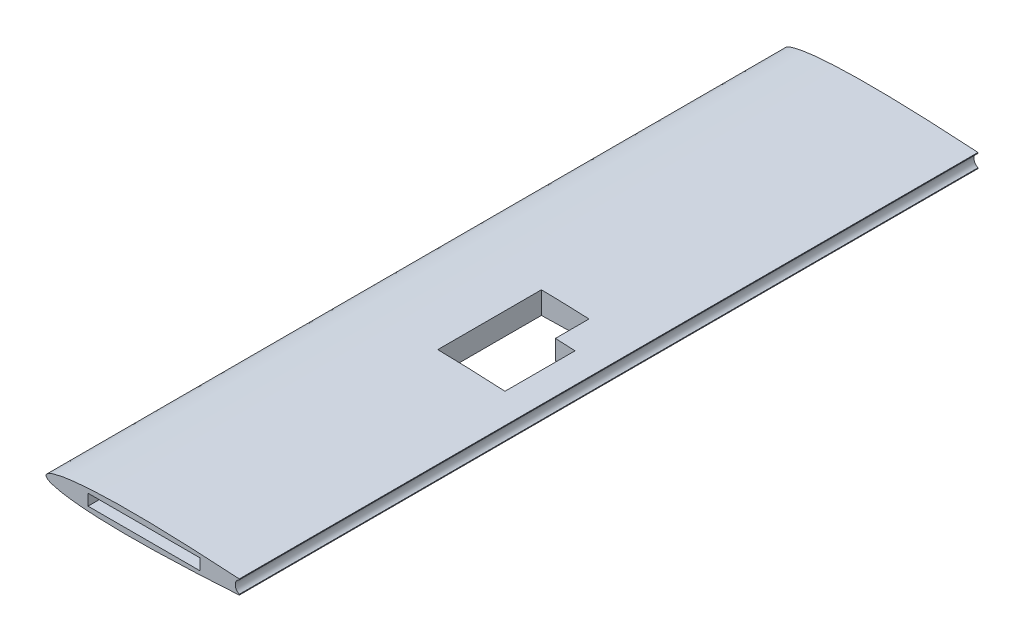
ISO-10303-21;
HEADER;
FILE_DESCRIPTION(('STEP AP214'),'2;1');
FILE_NAME('part.step','',(''),(''),'','','');
FILE_SCHEMA(('AUTOMOTIVE_DESIGN { 1 0 10303 214 1 1 1 1 }'));
ENDSEC;
DATA;
#1=APPLICATION_CONTEXT('core data for automotive mechanical design processes');
#2=APPLICATION_PROTOCOL_DEFINITION('international standard','automotive_design',2000,#1);
#3=PRODUCT_CONTEXT('',#1,'mechanical');
#4=PRODUCT('Part','Part','',(#3));
#5=PRODUCT_RELATED_PRODUCT_CATEGORY('part','',(#4));
#6=PRODUCT_DEFINITION_FORMATION('','',#4);
#7=PRODUCT_DEFINITION_CONTEXT('part definition',#1,'design');
#8=PRODUCT_DEFINITION('design','',#6,#7);
#9=PRODUCT_DEFINITION_SHAPE('','',#8);
#10=(LENGTH_UNIT() NAMED_UNIT(*) SI_UNIT(.MILLI.,.METRE.));
#11=(NAMED_UNIT(*) PLANE_ANGLE_UNIT() SI_UNIT($,.RADIAN.));
#12=(NAMED_UNIT(*) SI_UNIT($,.STERADIAN.) SOLID_ANGLE_UNIT());
#13=UNCERTAINTY_MEASURE_WITH_UNIT(LENGTH_MEASURE(1.E-05),#10,'distance_accuracy_value','');
#14=(GEOMETRIC_REPRESENTATION_CONTEXT(3) GLOBAL_UNCERTAINTY_ASSIGNED_CONTEXT((#13)) GLOBAL_UNIT_ASSIGNED_CONTEXT((#10,
#11,#12)) REPRESENTATION_CONTEXT('',''));
#15=CARTESIAN_POINT('',(0.,0.,0.));
#16=DIRECTION('',(0.,0.,1.));
#17=DIRECTION('',(1.,0.,0.));
#18=AXIS2_PLACEMENT_3D('',#15,#16,#17);
#19=CARTESIAN_POINT('',(0.,0.,0.));
#20=DIRECTION('',(0.,0.,-1.));
#21=DIRECTION('',(-1.,0.,0.));
#22=AXIS2_PLACEMENT_3D('',#19,#20,#21);
#23=PLANE('',#22);
#24=DIRECTION('',(0.,1.,0.));
#25=VECTOR('',#24,1.);
#26=CARTESIAN_POINT('',(69.0000000000131,0.,0.));
#27=LINE('',#26,#25);
#28=CARTESIAN_POINT('',(69.0000000000148,-2.50744788017682,0.));
#29=VERTEX_POINT('',#28);
#30=CARTESIAN_POINT('',(69.0000000000131,-2.22895693094243,0.));
#31=VERTEX_POINT('',#30);
#32=EDGE_CURVE('E321',#29,#31,#27,.T.);
#33=ORIENTED_EDGE('',*,*,#32,.F.);
#34=CARTESIAN_POINT('',(100.,0.084,0.));
#35=CARTESIAN_POINT('',(98.333488814933,0.236746480055364,0.));
#36=CARTESIAN_POINT('',(95.0011947254255,0.542172688557606,0.));
#37=CARTESIAN_POINT('',(88.3355596211879,1.11089898015662,0.));
#38=CARTESIAN_POINT('',(80.0032933562199,1.76361099520967,0.));
#39=CARTESIAN_POINT('',(70.0029989334555,2.45786169254404,0.));
#40=CARTESIAN_POINT('',(60.0031046254057,3.06174772348002,0.));
#41=CARTESIAN_POINT('',(50.0030086005351,3.55213921170033,0.));
#42=CARTESIAN_POINT('',(40.0025985576922,3.90294649372571,0.));
#43=CARTESIAN_POINT('',(31.666961485844,4.02526015065941,0.));
#44=CARTESIAN_POINT('',(24.9991546003269,3.97693379087482,0.));
#45=CARTESIAN_POINT('',(19.9977755867835,3.84497639830756,0.));
#46=CARTESIAN_POINT('',(14.9933631314586,3.59248695861782,0.));
#47=CARTESIAN_POINT('',(10.8271840648808,3.23765157891607,0.));
#48=CARTESIAN_POINT('',(7.48905438800269,2.81402136675529,0.));
#49=CARTESIAN_POINT('',(4.99359465012965,2.40367305928858,0.));
#50=CARTESIAN_POINT('',(2.84962633983361,1.86792549429032,0.));
#51=CARTESIAN_POINT('',(1.16541350274339,1.32098725183071,0.));
#52=CARTESIAN_POINT('',(-0.664613784127027,0.,0.));
#53=CARTESIAN_POINT('',(1.16541350274339,-1.32098725183071,0.));
#54=CARTESIAN_POINT('',(2.84962633983362,-1.86792549429032,0.));
#55=CARTESIAN_POINT('',(4.99359465012963,-2.40367305928857,0.));
#56=CARTESIAN_POINT('',(7.48905438800269,-2.81402136675529,0.));
#57=CARTESIAN_POINT('',(10.8271840648809,-3.23765157891607,0.));
#58=CARTESIAN_POINT('',(14.9933631314586,-3.59248695861782,0.));
#59=CARTESIAN_POINT('',(19.9977755867835,-3.84497639830756,0.));
#60=CARTESIAN_POINT('',(24.9991546003269,-3.97693379087482,0.));
#61=CARTESIAN_POINT('',(31.666961485844,-4.02526015065941,0.));
#62=CARTESIAN_POINT('',(40.0025985576922,-3.90294649372571,0.));
#63=CARTESIAN_POINT('',(50.0030086005351,-3.55213921170033,0.));
#64=CARTESIAN_POINT('',(60.0031046254058,-3.06174772348002,0.));
#65=CARTESIAN_POINT('',(70.0029989334555,-2.45786169254404,0.));
#66=CARTESIAN_POINT('',(80.0032933562199,-1.76361099520967,0.));
#67=CARTESIAN_POINT('',(88.3355596211879,-1.11089898015662,0.));
#68=CARTESIAN_POINT('',(95.0011947254255,-0.542172688557605,0.));
#69=CARTESIAN_POINT('',(98.333488814933,-0.236746480055364,0.));
#70=CARTESIAN_POINT('',(100.,-0.084,0.));
#71=B_SPLINE_CURVE_WITH_KNOTS('',3,(#34,#35,#36,#37,#38,#39,#40,#41,#42,#43,#44,#45,#46,#47,#48,
#49,#50,#51,#52,#53,#54,#55,#56,#57,#58,#59,#60,#61,#62,#63,#64,#65,#66,#67,#68,#69,#70),
.UNSPECIFIED.,.F.,.F.,(4,1,1,1,1,1,1,1,1,1,1,1,1,1,1,1,1,1,1,1,1,1,1,1,1,1,1,1,1,1,1,1,1,1,4),
(0.,0.0248762929189861,0.0497417146704998,0.0994434021110951,0.149112224036195,
0.198750974066913,0.248359097492202,0.297937369716024,0.347491327096237,0.37226694027957,
0.39705092368842,0.421859474838904,0.446731345826762,0.459220451479859,0.471790601601357,
0.484560454432956,0.491195112481227,0.5,0.508804887518773,0.515439545567044,0.528209398398643,
0.540779548520141,0.553268654173238,0.578140525161096,0.60294907631158,0.62773305972043,
0.652508672903763,0.702062630283976,0.751640902507798,0.801249025933086,0.850887775963805,
0.900556597888905,0.9502582853295,0.975123707081014,1.),.UNSPECIFIED.);
#72=CARTESIAN_POINT('',(69.0000000000131,2.50744788017694,0.));
#73=VERTEX_POINT('',#72);
#74=EDGE_CURVE('E305',#73,#29,#71,.T.);
#75=ORIENTED_EDGE('',*,*,#74,.F.);
#76=DIRECTION('',(0.,-1.,0.));
#77=VECTOR('',#76,1.);
#78=CARTESIAN_POINT('',(69.0000000000131,2.50744788017694,0.));
#79=LINE('',#78,#77);
#80=CARTESIAN_POINT('',(69.0000000000131,2.22895693094441,0.));
#81=VERTEX_POINT('',#80);
#82=EDGE_CURVE('E284',#73,#81,#79,.T.);
#83=ORIENTED_EDGE('',*,*,#82,.T.);
#84=CARTESIAN_POINT('',(70.0000000000131,9.91394466520745E-13,0.));
#85=DIRECTION('',(0.,0.,-1.));
#86=DIRECTION('',(1.,0.,0.));
#87=AXIS2_PLACEMENT_3D('',#84,#85,#86);
#88=CIRCLE('',#87,2.44300000000014);
#89=EDGE_CURVE('E314',#31,#81,#88,.T.);
#90=ORIENTED_EDGE('',*,*,#89,.F.);
#91=EDGE_LOOP('',(#33,#75,#83,#90));
#92=FACE_BOUND('',#91,.T.);
#93=DIRECTION('',(-1.,0.,0.));
#94=VECTOR('',#93,1.);
#95=CARTESIAN_POINT('',(55.,2.,0.));
#96=LINE('',#95,#94);
#97=CARTESIAN_POINT('',(55.,2.,0.));
#98=VERTEX_POINT('',#97);
#99=CARTESIAN_POINT('',(15.,2.,0.));
#100=VERTEX_POINT('',#99);
#101=EDGE_CURVE('E204',#98,#100,#96,.T.);
#102=ORIENTED_EDGE('',*,*,#101,.T.);
#103=DIRECTION('',(0.,-1.,0.));
#104=VECTOR('',#103,1.);
#105=CARTESIAN_POINT('',(15.,2.,0.));
#106=LINE('',#105,#104);
#107=CARTESIAN_POINT('',(15.,-2.,0.));
#108=VERTEX_POINT('',#107);
#109=EDGE_CURVE('E58',#100,#108,#106,.T.);
#110=ORIENTED_EDGE('',*,*,#109,.T.);
#111=DIRECTION('',(1.,0.,0.));
#112=VECTOR('',#111,1.);
#113=CARTESIAN_POINT('',(55.,-2.,0.));
#114=LINE('',#113,#112);
#115=CARTESIAN_POINT('',(55.,-2.,0.));
#116=VERTEX_POINT('',#115);
#117=EDGE_CURVE('E191',#108,#116,#114,.T.);
#118=ORIENTED_EDGE('',*,*,#117,.T.);
#119=DIRECTION('',(0.,1.,0.));
#120=VECTOR('',#119,1.);
#121=CARTESIAN_POINT('',(55.,2.,0.));
#122=LINE('',#121,#120);
#123=EDGE_CURVE('E195',#116,#98,#122,.T.);
#124=ORIENTED_EDGE('',*,*,#123,.T.);
#125=EDGE_LOOP('',(#102,#110,#118,#124));
#126=FACE_BOUND('',#125,.T.);
#127=ADVANCED_FACE('F41',(#92,#126),#23,.T.);
#128=CARTESIAN_POINT('',(100.,0.084,263.67));
#129=CARTESIAN_POINT('',(98.333488814933,0.236746480055364,263.67));
#130=CARTESIAN_POINT('',(95.0011947254255,0.542172688557606,263.67));
#131=CARTESIAN_POINT('',(88.3355596211879,1.11089898015662,263.67));
#132=CARTESIAN_POINT('',(80.0032933562199,1.76361099520967,263.67));
#133=CARTESIAN_POINT('',(70.0029989334555,2.45786169254404,263.67));
#134=CARTESIAN_POINT('',(60.0031046254057,3.06174772348002,263.67));
#135=CARTESIAN_POINT('',(50.0030086005351,3.55213921170033,263.67));
#136=CARTESIAN_POINT('',(40.0025985576922,3.90294649372571,263.67));
#137=CARTESIAN_POINT('',(31.666961485844,4.02526015065941,263.67));
#138=CARTESIAN_POINT('',(24.9991546003269,3.97693379087482,263.67));
#139=CARTESIAN_POINT('',(19.9977755867835,3.84497639830756,263.67));
#140=CARTESIAN_POINT('',(14.9933631314586,3.59248695861782,263.67));
#141=CARTESIAN_POINT('',(10.8271840648808,3.23765157891607,263.67));
#142=CARTESIAN_POINT('',(7.48905438800269,2.81402136675529,263.67));
#143=CARTESIAN_POINT('',(4.99359465012965,2.40367305928858,263.67));
#144=CARTESIAN_POINT('',(2.84962633983361,1.86792549429032,263.67));
#145=CARTESIAN_POINT('',(1.16541350274339,1.32098725183071,263.67));
#146=CARTESIAN_POINT('',(-0.664613784127027,0.,263.67));
#147=CARTESIAN_POINT('',(1.16541350274339,-1.32098725183071,263.67));
#148=CARTESIAN_POINT('',(2.84962633983362,-1.86792549429032,263.67));
#149=CARTESIAN_POINT('',(4.99359465012963,-2.40367305928857,263.67));
#150=CARTESIAN_POINT('',(7.48905438800269,-2.81402136675529,263.67));
#151=CARTESIAN_POINT('',(10.8271840648809,-3.23765157891607,263.67));
#152=CARTESIAN_POINT('',(14.9933631314586,-3.59248695861782,263.67));
#153=CARTESIAN_POINT('',(19.9977755867835,-3.84497639830756,263.67));
#154=CARTESIAN_POINT('',(24.9991546003269,-3.97693379087482,263.67));
#155=CARTESIAN_POINT('',(31.666961485844,-4.02526015065941,263.67));
#156=CARTESIAN_POINT('',(40.0025985576922,-3.90294649372571,263.67));
#157=CARTESIAN_POINT('',(50.0030086005351,-3.55213921170033,263.67));
#158=CARTESIAN_POINT('',(60.0031046254058,-3.06174772348002,263.67));
#159=CARTESIAN_POINT('',(70.0029989334555,-2.45786169254404,263.67));
#160=CARTESIAN_POINT('',(80.0032933562199,-1.76361099520967,263.67));
#161=CARTESIAN_POINT('',(88.3355596211879,-1.11089898015662,263.67));
#162=CARTESIAN_POINT('',(95.0011947254255,-0.542172688557605,263.67));
#163=CARTESIAN_POINT('',(98.333488814933,-0.236746480055364,263.67));
#164=CARTESIAN_POINT('',(100.,-0.084,263.67));
#165=B_SPLINE_CURVE_WITH_KNOTS('',3,(#128,#129,#130,#131,#132,#133,#134,#135,#136,#137,#138,
#139,#140,#141,#142,#143,#144,#145,#146,#147,#148,#149,#150,#151,#152,#153,#154,#155,#156,#157,
#158,#159,#160,#161,#162,#163,#164),.UNSPECIFIED.,.F.,.F.,(4,1,1,1,1,1,1,1,1,1,1,1,1,1,1,1,1,1,
1,1,1,1,1,1,1,1,1,1,1,1,1,1,1,1,4),(0.,0.0248762929189861,0.0497417146704998,0.0994434021110951,
0.149112224036195,0.198750974066913,0.248359097492202,0.297937369716024,0.347491327096237,
0.37226694027957,0.39705092368842,0.421859474838904,0.446731345826762,0.459220451479859,
0.471790601601357,0.484560454432956,0.491195112481227,0.5,0.508804887518773,0.515439545567044,
0.528209398398643,0.540779548520141,0.553268654173238,0.578140525161096,0.60294907631158,
0.62773305972043,0.652508672903763,0.702062630283976,0.751640902507798,0.801249025933086,
0.850887775963805,0.900556597888905,0.9502582853295,0.975123707081014,1.),.UNSPECIFIED.);
#166=DIRECTION('',(0.,0.,-1.));
#167=VECTOR('',#166,1.);
#168=SURFACE_OF_LINEAR_EXTRUSION('',#165,#167);
#169=CARTESIAN_POINT('',(100.,0.084,158.835));
#170=CARTESIAN_POINT('',(98.333488814933,0.236746480055364,158.835));
#171=CARTESIAN_POINT('',(95.0011947254255,0.542172688557606,158.835));
#172=CARTESIAN_POINT('',(88.3355596211879,1.11089898015662,158.835));
#173=CARTESIAN_POINT('',(80.0032933562199,1.76361099520967,158.835));
#174=CARTESIAN_POINT('',(70.0029989334555,2.45786169254404,158.835));
#175=CARTESIAN_POINT('',(60.0031046254057,3.06174772348002,158.835));
#176=CARTESIAN_POINT('',(50.0030086005351,3.55213921170033,158.835));
#177=CARTESIAN_POINT('',(40.0025985576922,3.90294649372571,158.835));
#178=CARTESIAN_POINT('',(31.666961485844,4.02526015065941,158.835));
#179=CARTESIAN_POINT('',(24.9991546003269,3.97693379087482,158.835));
#180=CARTESIAN_POINT('',(19.9977755867835,3.84497639830756,158.835));
#181=CARTESIAN_POINT('',(14.9933631314586,3.59248695861782,158.835));
#182=CARTESIAN_POINT('',(10.8271840648808,3.23765157891607,158.835));
#183=CARTESIAN_POINT('',(7.48905438800269,2.81402136675529,158.835));
#184=CARTESIAN_POINT('',(4.99359465012965,2.40367305928858,158.835));
#185=CARTESIAN_POINT('',(2.84962633983361,1.86792549429032,158.835));
#186=CARTESIAN_POINT('',(1.16541350274339,1.32098725183071,158.835));
#187=CARTESIAN_POINT('',(-0.664613784127027,0.,158.835));
#188=CARTESIAN_POINT('',(1.16541350274339,-1.32098725183071,158.835));
#189=CARTESIAN_POINT('',(2.84962633983362,-1.86792549429032,158.835));
#190=CARTESIAN_POINT('',(4.99359465012963,-2.40367305928857,158.835));
#191=CARTESIAN_POINT('',(7.48905438800269,-2.81402136675529,158.835));
#192=CARTESIAN_POINT('',(10.8271840648809,-3.23765157891607,158.835));
#193=CARTESIAN_POINT('',(14.9933631314586,-3.59248695861782,158.835));
#194=CARTESIAN_POINT('',(19.9977755867835,-3.84497639830756,158.835));
#195=CARTESIAN_POINT('',(24.9991546003269,-3.97693379087482,158.835));
#196=CARTESIAN_POINT('',(31.666961485844,-4.02526015065941,158.835));
#197=CARTESIAN_POINT('',(40.0025985576922,-3.90294649372571,158.835));
#198=CARTESIAN_POINT('',(50.0030086005351,-3.55213921170033,158.835));
#199=CARTESIAN_POINT('',(60.0031046254058,-3.06174772348002,158.835));
#200=CARTESIAN_POINT('',(70.0029989334555,-2.45786169254404,158.835));
#201=CARTESIAN_POINT('',(80.0032933562199,-1.76361099520967,158.835));
#202=CARTESIAN_POINT('',(88.3355596211879,-1.11089898015662,158.835));
#203=CARTESIAN_POINT('',(95.0011947254255,-0.542172688557605,158.835));
#204=CARTESIAN_POINT('',(98.333488814933,-0.236746480055364,158.835));
#205=CARTESIAN_POINT('',(100.,-0.084,158.835));
#206=B_SPLINE_CURVE_WITH_KNOTS('',3,(#169,#170,#171,#172,#173,#174,#175,#176,#177,#178,#179,
#180,#181,#182,#183,#184,#185,#186,#187,#188,#189,#190,#191,#192,#193,#194,#195,#196,#197,#198,
#199,#200,#201,#202,#203,#204,#205),.UNSPECIFIED.,.F.,.F.,(4,1,1,1,1,1,1,1,1,1,1,1,1,1,1,1,1,1,
1,1,1,1,1,1,1,1,1,1,1,1,1,1,1,1,4),(0.,0.0248762929189861,0.0497417146704998,0.0994434021110951,
0.149112224036195,0.198750974066913,0.248359097492202,0.297937369716024,0.347491327096237,
0.37226694027957,0.39705092368842,0.421859474838904,0.446731345826762,0.459220451479859,
0.471790601601357,0.484560454432956,0.491195112481227,0.5,0.508804887518773,0.515439545567044,
0.528209398398643,0.540779548520141,0.553268654173238,0.578140525161096,0.60294907631158,
0.62773305972043,0.652508672903763,0.702062630283976,0.751640902507798,0.801249025933086,
0.850887775963805,0.900556597888905,0.9502582853295,0.975123707081014,1.),.UNSPECIFIED.);
#207=CARTESIAN_POINT('',(59.0000000000131,3.0971385419133,158.835));
#208=VERTEX_POINT('',#207);
#209=CARTESIAN_POINT('',(35.0000000000106,3.96601398134451,158.835));
#210=VERTEX_POINT('',#209);
#211=EDGE_CURVE('E342',#208,#210,#206,.T.);
#212=ORIENTED_EDGE('',*,*,#211,.T.);
#213=DIRECTION('',(0.,0.,-1.));
#214=VECTOR('',#213,1.);
#215=CARTESIAN_POINT('',(35.0000000000131,3.96601398134447,263.67));
#216=LINE('',#215,#214);
#217=CARTESIAN_POINT('',(35.0000000000131,3.96601398134451,121.835));
#218=VERTEX_POINT('',#217);
#219=EDGE_CURVE('E11',#210,#218,#216,.T.);
#220=ORIENTED_EDGE('',*,*,#219,.T.);
#221=CARTESIAN_POINT('',(100.,0.084,121.835));
#222=CARTESIAN_POINT('',(98.333488814933,0.236746480055364,121.835));
#223=CARTESIAN_POINT('',(95.0011947254255,0.542172688557606,121.835));
#224=CARTESIAN_POINT('',(88.3355596211879,1.11089898015662,121.835));
#225=CARTESIAN_POINT('',(80.0032933562199,1.76361099520967,121.835));
#226=CARTESIAN_POINT('',(70.0029989334555,2.45786169254404,121.835));
#227=CARTESIAN_POINT('',(60.0031046254057,3.06174772348002,121.835));
#228=CARTESIAN_POINT('',(50.0030086005351,3.55213921170033,121.835));
#229=CARTESIAN_POINT('',(40.0025985576922,3.90294649372571,121.835));
#230=CARTESIAN_POINT('',(31.666961485844,4.02526015065941,121.835));
#231=CARTESIAN_POINT('',(24.9991546003269,3.97693379087482,121.835));
#232=CARTESIAN_POINT('',(19.9977755867835,3.84497639830756,121.835));
#233=CARTESIAN_POINT('',(14.9933631314586,3.59248695861782,121.835));
#234=CARTESIAN_POINT('',(10.8271840648808,3.23765157891607,121.835));
#235=CARTESIAN_POINT('',(7.48905438800269,2.81402136675529,121.835));
#236=CARTESIAN_POINT('',(4.99359465012965,2.40367305928858,121.835));
#237=CARTESIAN_POINT('',(2.84962633983361,1.86792549429032,121.835));
#238=CARTESIAN_POINT('',(1.16541350274339,1.32098725183071,121.835));
#239=CARTESIAN_POINT('',(-0.664613784127027,0.,121.835));
#240=CARTESIAN_POINT('',(1.16541350274339,-1.32098725183071,121.835));
#241=CARTESIAN_POINT('',(2.84962633983362,-1.86792549429032,121.835));
#242=CARTESIAN_POINT('',(4.99359465012963,-2.40367305928857,121.835));
#243=CARTESIAN_POINT('',(7.48905438800269,-2.81402136675529,121.835));
#244=CARTESIAN_POINT('',(10.8271840648809,-3.23765157891607,121.835));
#245=CARTESIAN_POINT('',(14.9933631314586,-3.59248695861782,121.835));
#246=CARTESIAN_POINT('',(19.9977755867835,-3.84497639830756,121.835));
#247=CARTESIAN_POINT('',(24.9991546003269,-3.97693379087482,121.835));
#248=CARTESIAN_POINT('',(31.666961485844,-4.02526015065941,121.835));
#249=CARTESIAN_POINT('',(40.0025985576922,-3.90294649372571,121.835));
#250=CARTESIAN_POINT('',(50.0030086005351,-3.55213921170033,121.835));
#251=CARTESIAN_POINT('',(60.0031046254058,-3.06174772348002,121.835));
#252=CARTESIAN_POINT('',(70.0029989334555,-2.45786169254404,121.835));
#253=CARTESIAN_POINT('',(80.0032933562199,-1.76361099520967,121.835));
#254=CARTESIAN_POINT('',(88.3355596211879,-1.11089898015662,121.835));
#255=CARTESIAN_POINT('',(95.0011947254255,-0.542172688557605,121.835));
#256=CARTESIAN_POINT('',(98.333488814933,-0.236746480055364,121.835));
#257=CARTESIAN_POINT('',(100.,-0.084,121.835));
#258=B_SPLINE_CURVE_WITH_KNOTS('',3,(#221,#222,#223,#224,#225,#226,#227,#228,#229,#230,#231,
#232,#233,#234,#235,#236,#237,#238,#239,#240,#241,#242,#243,#244,#245,#246,#247,#248,#249,#250,
#251,#252,#253,#254,#255,#256,#257),.UNSPECIFIED.,.F.,.F.,(4,1,1,1,1,1,1,1,1,1,1,1,1,1,1,1,1,1,
1,1,1,1,1,1,1,1,1,1,1,1,1,1,1,1,4),(0.,0.0248762929189861,0.0497417146704998,0.0994434021110951,
0.149112224036195,0.198750974066913,0.248359097492202,0.297937369716024,0.347491327096237,
0.37226694027957,0.39705092368842,0.421859474838904,0.446731345826762,0.459220451479859,
0.471790601601357,0.484560454432956,0.491195112481227,0.5,0.508804887518773,0.515439545567044,
0.528209398398643,0.540779548520141,0.553268654173238,0.578140525161096,0.60294907631158,
0.62773305972043,0.652508672903763,0.702062630283976,0.751640902507798,0.801249025933086,
0.850887775963805,0.900556597888905,0.9502582853295,0.975123707081014,1.),.UNSPECIFIED.);
#259=CARTESIAN_POINT('',(52.0000000000131,3.4421332996332,121.835));
#260=VERTEX_POINT('',#259);
#261=EDGE_CURVE('E51',#218,#260,#258,.F.);
#262=ORIENTED_EDGE('',*,*,#261,.T.);
#263=DIRECTION('',(0.,0.,-1.));
#264=VECTOR('',#263,1.);
#265=CARTESIAN_POINT('',(52.0000000000131,3.4421332996332,263.67));
#266=LINE('',#265,#264);
#267=CARTESIAN_POINT('',(52.0000000000131,3.44213329876261,133.835));
#268=VERTEX_POINT('',#267);
#269=EDGE_CURVE('E379',#260,#268,#266,.F.);
#270=ORIENTED_EDGE('',*,*,#269,.T.);
#271=CARTESIAN_POINT('',(100.,0.084,133.835));
#272=CARTESIAN_POINT('',(98.333488814933,0.236746480055364,133.835));
#273=CARTESIAN_POINT('',(95.0011947254255,0.542172688557606,133.835));
#274=CARTESIAN_POINT('',(88.3355596211879,1.11089898015662,133.835));
#275=CARTESIAN_POINT('',(80.0032933562199,1.76361099520967,133.835));
#276=CARTESIAN_POINT('',(70.0029989334555,2.45786169254404,133.835));
#277=CARTESIAN_POINT('',(60.0031046254057,3.06174772348002,133.835));
#278=CARTESIAN_POINT('',(50.0030086005351,3.55213921170033,133.835));
#279=CARTESIAN_POINT('',(40.0025985576922,3.90294649372571,133.835));
#280=CARTESIAN_POINT('',(31.666961485844,4.02526015065941,133.835));
#281=CARTESIAN_POINT('',(24.9991546003269,3.97693379087482,133.835));
#282=CARTESIAN_POINT('',(19.9977755867835,3.84497639830756,133.835));
#283=CARTESIAN_POINT('',(14.9933631314586,3.59248695861782,133.835));
#284=CARTESIAN_POINT('',(10.8271840648808,3.23765157891607,133.835));
#285=CARTESIAN_POINT('',(7.48905438800269,2.81402136675529,133.835));
#286=CARTESIAN_POINT('',(4.99359465012965,2.40367305928858,133.835));
#287=CARTESIAN_POINT('',(2.84962633983361,1.86792549429032,133.835));
#288=CARTESIAN_POINT('',(1.16541350274339,1.32098725183071,133.835));
#289=CARTESIAN_POINT('',(-0.664613784127027,0.,133.835));
#290=CARTESIAN_POINT('',(1.16541350274339,-1.32098725183071,133.835));
#291=CARTESIAN_POINT('',(2.84962633983362,-1.86792549429032,133.835));
#292=CARTESIAN_POINT('',(4.99359465012963,-2.40367305928857,133.835));
#293=CARTESIAN_POINT('',(7.48905438800269,-2.81402136675529,133.835));
#294=CARTESIAN_POINT('',(10.8271840648809,-3.23765157891607,133.835));
#295=CARTESIAN_POINT('',(14.9933631314586,-3.59248695861782,133.835));
#296=CARTESIAN_POINT('',(19.9977755867835,-3.84497639830756,133.835));
#297=CARTESIAN_POINT('',(24.9991546003269,-3.97693379087482,133.835));
#298=CARTESIAN_POINT('',(31.666961485844,-4.02526015065941,133.835));
#299=CARTESIAN_POINT('',(40.0025985576922,-3.90294649372571,133.835));
#300=CARTESIAN_POINT('',(50.0030086005351,-3.55213921170033,133.835));
#301=CARTESIAN_POINT('',(60.0031046254058,-3.06174772348002,133.835));
#302=CARTESIAN_POINT('',(70.0029989334555,-2.45786169254404,133.835));
#303=CARTESIAN_POINT('',(80.0032933562199,-1.76361099520967,133.835));
#304=CARTESIAN_POINT('',(88.3355596211879,-1.11089898015662,133.835));
#305=CARTESIAN_POINT('',(95.0011947254255,-0.542172688557605,133.835));
#306=CARTESIAN_POINT('',(98.333488814933,-0.236746480055364,133.835));
#307=CARTESIAN_POINT('',(100.,-0.084,133.835));
#308=B_SPLINE_CURVE_WITH_KNOTS('',3,(#271,#272,#273,#274,#275,#276,#277,#278,#279,#280,#281,
#282,#283,#284,#285,#286,#287,#288,#289,#290,#291,#292,#293,#294,#295,#296,#297,#298,#299,#300,
#301,#302,#303,#304,#305,#306,#307),.UNSPECIFIED.,.F.,.F.,(4,1,1,1,1,1,1,1,1,1,1,1,1,1,1,1,1,1,
1,1,1,1,1,1,1,1,1,1,1,1,1,1,1,1,4),(0.,0.0248762929189861,0.0497417146704998,0.0994434021110951,
0.149112224036195,0.198750974066913,0.248359097492202,0.297937369716024,0.347491327096237,
0.37226694027957,0.39705092368842,0.421859474838904,0.446731345826762,0.459220451479859,
0.471790601601357,0.484560454432956,0.491195112481227,0.5,0.508804887518773,0.515439545567044,
0.528209398398643,0.540779548520141,0.553268654173238,0.578140525161096,0.60294907631158,
0.62773305972043,0.652508672903763,0.702062630283976,0.751640902507798,0.801249025933086,
0.850887775963805,0.900556597888905,0.9502582853295,0.975123707081014,1.),.UNSPECIFIED.);
#309=CARTESIAN_POINT('',(59.0000000000131,3.09713854191332,133.835));
#310=VERTEX_POINT('',#309);
#311=EDGE_CURVE('E356',#268,#310,#308,.F.);
#312=ORIENTED_EDGE('',*,*,#311,.T.);
#313=DIRECTION('',(0.,0.,-1.));
#314=VECTOR('',#313,1.);
#315=CARTESIAN_POINT('',(59.0000000000131,3.09713854191332,263.67));
#316=LINE('',#315,#314);
#317=EDGE_CURVE('E376',#310,#208,#316,.F.);
#318=ORIENTED_EDGE('',*,*,#317,.T.);
#319=EDGE_LOOP('',(#212,#220,#262,#270,#312,#318));
#320=FACE_BOUND('',#319,.T.);
#321=CARTESIAN_POINT('',(52.0000000000131,-3.4421332996332,121.835));
#322=VERTEX_POINT('',#321);
#323=CARTESIAN_POINT('',(35.0000000000131,-3.96601398134451,121.835));
#324=VERTEX_POINT('',#323);
#325=EDGE_CURVE('E363',#322,#324,#258,.F.);
#326=ORIENTED_EDGE('',*,*,#325,.T.);
#327=DIRECTION('',(0.,0.,-1.));
#328=VECTOR('',#327,1.);
#329=CARTESIAN_POINT('',(35.0000000000131,-3.96601398134447,263.67));
#330=LINE('',#329,#328);
#331=CARTESIAN_POINT('',(35.0000000000131,-3.96601398134451,158.835));
#332=VERTEX_POINT('',#331);
#333=EDGE_CURVE('E369',#324,#332,#330,.F.);
#334=ORIENTED_EDGE('',*,*,#333,.T.);
#335=CARTESIAN_POINT('',(59.0000000000135,-3.0971385419133,158.835));
#336=VERTEX_POINT('',#335);
#337=EDGE_CURVE('E335',#332,#336,#206,.T.);
#338=ORIENTED_EDGE('',*,*,#337,.T.);
#339=DIRECTION('',(0.,0.,-1.));
#340=VECTOR('',#339,1.);
#341=CARTESIAN_POINT('',(59.0000000000131,-3.09713854191332,263.67));
#342=LINE('',#341,#340);
#343=CARTESIAN_POINT('',(59.0000000000131,-3.09713854191332,133.835));
#344=VERTEX_POINT('',#343);
#345=EDGE_CURVE('E341',#336,#344,#342,.T.);
#346=ORIENTED_EDGE('',*,*,#345,.T.);
#347=CARTESIAN_POINT('',(52.0000000000131,-3.44213329876262,133.835));
#348=VERTEX_POINT('',#347);
#349=EDGE_CURVE('E349',#344,#348,#308,.F.);
#350=ORIENTED_EDGE('',*,*,#349,.T.);
#351=DIRECTION('',(0.,0.,-1.));
#352=VECTOR('',#351,1.);
#353=CARTESIAN_POINT('',(52.000000000013,-3.4421332996332,263.67));
#354=LINE('',#353,#352);
#355=EDGE_CURVE('E355',#348,#322,#354,.T.);
#356=ORIENTED_EDGE('',*,*,#355,.T.);
#357=EDGE_LOOP('',(#326,#334,#338,#346,#350,#356));
#358=FACE_BOUND('',#357,.T.);
#359=ORIENTED_EDGE('',*,*,#74,.T.);
#360=DIRECTION('',(0.,0.,1.));
#361=VECTOR('',#360,1.);
#362=CARTESIAN_POINT('',(69.0000000000131,-2.50744788017495,0.));
#363=LINE('',#362,#361);
#364=CARTESIAN_POINT('',(69.0000000000131,-2.50744788017495,263.67));
#365=VERTEX_POINT('',#364);
#366=EDGE_CURVE('E292',#29,#365,#363,.T.);
#367=ORIENTED_EDGE('',*,*,#366,.T.);
#368=CARTESIAN_POINT('',(69.0000000000131,2.50744788017694,263.67));
#369=VERTEX_POINT('',#368);
#370=EDGE_CURVE('E306',#369,#365,#165,.T.);
#371=ORIENTED_EDGE('',*,*,#370,.F.);
#372=DIRECTION('',(0.,0.,1.));
#373=VECTOR('',#372,1.);
#374=CARTESIAN_POINT('',(69.0000000000131,2.50744788017694,0.));
#375=LINE('',#374,#373);
#376=EDGE_CURVE('E288',#73,#369,#375,.T.);
#377=ORIENTED_EDGE('',*,*,#376,.F.);
#378=EDGE_LOOP('',(#359,#367,#371,#377));
#379=FACE_BOUND('',#378,.T.);
#380=ADVANCED_FACE('F43',(#320,#358,#379),#168,.F.);
#381=CARTESIAN_POINT('',(70.0000000000131,9.91394466520745E-13,263.67));
#382=DIRECTION('',(0.,0.,-1.));
#383=DIRECTION('',(-1.,0.,0.));
#384=AXIS2_PLACEMENT_3D('',#381,#382,#383);
#385=CYLINDRICAL_SURFACE('',#384,2.44300000000014);
#386=ORIENTED_EDGE('',*,*,#89,.T.);
#387=DIRECTION('',(0.,0.,-1.));
#388=VECTOR('',#387,1.);
#389=CARTESIAN_POINT('',(69.0000000000131,2.22895693094441,263.67));
#390=LINE('',#389,#388);
#391=CARTESIAN_POINT('',(69.0000000000131,2.22895693094441,263.67));
#392=VERTEX_POINT('',#391);
#393=EDGE_CURVE('E302',#81,#392,#390,.F.);
#394=ORIENTED_EDGE('',*,*,#393,.T.);
#395=CARTESIAN_POINT('',(70.0000000000131,9.91394466520745E-13,263.67));
#396=DIRECTION('',(0.,0.,-1.));
#397=DIRECTION('',(1.,0.,0.));
#398=AXIS2_PLACEMENT_3D('',#395,#396,#397);
#399=CIRCLE('',#398,2.44300000000014);
#400=CARTESIAN_POINT('',(69.0000000000131,-2.22895693094243,263.67));
#401=VERTEX_POINT('',#400);
#402=EDGE_CURVE('E313',#401,#392,#399,.T.);
#403=ORIENTED_EDGE('',*,*,#402,.F.);
#404=DIRECTION('',(0.,0.,-1.));
#405=VECTOR('',#404,1.);
#406=CARTESIAN_POINT('',(69.0000000000131,-2.22895693094243,263.67));
#407=LINE('',#406,#405);
#408=EDGE_CURVE('E296',#401,#31,#407,.T.);
#409=ORIENTED_EDGE('',*,*,#408,.T.);
#410=EDGE_LOOP('',(#386,#394,#403,#409));
#411=FACE_BOUND('',#410,.T.);
#412=ADVANCED_FACE('F420',(#411),#385,.F.);
#413=CARTESIAN_POINT('',(0.,0.,263.67));
#414=DIRECTION('',(0.,0.,-1.));
#415=DIRECTION('',(-1.,0.,0.));
#416=AXIS2_PLACEMENT_3D('',#413,#414,#415);
#417=PLANE('',#416);
#418=DIRECTION('',(1.,0.,0.));
#419=VECTOR('',#418,1.);
#420=CARTESIAN_POINT('',(55.,-2.,263.67));
#421=LINE('',#420,#419);
#422=CARTESIAN_POINT('',(15.,-2.,263.67));
#423=VERTEX_POINT('',#422);
#424=CARTESIAN_POINT('',(55.,-2.,263.67));
#425=VERTEX_POINT('',#424);
#426=EDGE_CURVE('E238',#423,#425,#421,.T.);
#427=ORIENTED_EDGE('',*,*,#426,.F.);
#428=DIRECTION('',(0.,-1.,0.));
#429=VECTOR('',#428,1.);
#430=CARTESIAN_POINT('',(15.,2.,263.67));
#431=LINE('',#430,#429);
#432=CARTESIAN_POINT('',(15.,2.,263.67));
#433=VERTEX_POINT('',#432);
#434=EDGE_CURVE('E66',#433,#423,#431,.T.);
#435=ORIENTED_EDGE('',*,*,#434,.F.);
#436=DIRECTION('',(-1.,0.,0.));
#437=VECTOR('',#436,1.);
#438=CARTESIAN_POINT('',(55.,2.,263.67));
#439=LINE('',#438,#437);
#440=CARTESIAN_POINT('',(55.,2.,263.67));
#441=VERTEX_POINT('',#440);
#442=EDGE_CURVE('E223',#441,#433,#439,.T.);
#443=ORIENTED_EDGE('',*,*,#442,.F.);
#444=DIRECTION('',(0.,1.,0.));
#445=VECTOR('',#444,1.);
#446=CARTESIAN_POINT('',(55.,2.,263.67));
#447=LINE('',#446,#445);
#448=EDGE_CURVE('E242',#425,#441,#447,.T.);
#449=ORIENTED_EDGE('',*,*,#448,.F.);
#450=EDGE_LOOP('',(#427,#435,#443,#449));
#451=FACE_BOUND('',#450,.T.);
#452=ORIENTED_EDGE('',*,*,#370,.T.);
#453=DIRECTION('',(0.,-1.,0.));
#454=VECTOR('',#453,1.);
#455=CARTESIAN_POINT('',(69.0000000000131,2.50744788017694,263.67));
#456=LINE('',#455,#454);
#457=EDGE_CURVE('E265',#401,#365,#456,.T.);
#458=ORIENTED_EDGE('',*,*,#457,.F.);
#459=ORIENTED_EDGE('',*,*,#402,.T.);
#460=EDGE_CURVE('E289',#369,#392,#456,.T.);
#461=ORIENTED_EDGE('',*,*,#460,.F.);
#462=EDGE_LOOP('',(#452,#458,#459,#461));
#463=FACE_BOUND('',#462,.T.);
#464=ADVANCED_FACE('F416',(#451,#463),#417,.F.);
#465=CARTESIAN_POINT('',(69.0000000000131,2.50744788017694,0.));
#466=DIRECTION('',(-1.,0.,0.));
#467=DIRECTION('',(0.,0.,1.));
#468=AXIS2_PLACEMENT_3D('',#465,#466,#467);
#469=PLANE('',#468);
#470=ORIENTED_EDGE('',*,*,#82,.F.);
#471=ORIENTED_EDGE('',*,*,#376,.T.);
#472=ORIENTED_EDGE('',*,*,#460,.T.);
#473=ORIENTED_EDGE('',*,*,#393,.F.);
#474=EDGE_LOOP('',(#470,#471,#472,#473));
#475=FACE_BOUND('',#474,.T.);
#476=ADVANCED_FACE('F418',(#475),#469,.F.);
#477=ORIENTED_EDGE('',*,*,#457,.T.);
#478=ORIENTED_EDGE('',*,*,#366,.F.);
#479=ORIENTED_EDGE('',*,*,#32,.T.);
#480=ORIENTED_EDGE('',*,*,#408,.F.);
#481=EDGE_LOOP('',(#477,#478,#479,#480));
#482=FACE_BOUND('',#481,.T.);
#483=ADVANCED_FACE('F408',(#482),#469,.F.);
#484=CARTESIAN_POINT('',(35.0000000000131,-4.02526015065941,133.835));
#485=DIRECTION('',(-1.,0.,0.));
#486=DIRECTION('',(0.,0.,1.));
#487=AXIS2_PLACEMENT_3D('',#484,#485,#486);
#488=PLANE('',#487);
#489=DIRECTION('',(0.,1.,0.));
#490=VECTOR('',#489,1.);
#491=CARTESIAN_POINT('',(35.0000000000131,-4.02526015065941,158.835));
#492=LINE('',#491,#490);
#493=EDGE_CURVE('E252',#332,#210,#492,.T.);
#494=ORIENTED_EDGE('',*,*,#493,.F.);
#495=ORIENTED_EDGE('',*,*,#333,.F.);
#496=DIRECTION('',(0.,1.,0.));
#497=VECTOR('',#496,1.);
#498=CARTESIAN_POINT('',(35.0000000000131,-4.02526015065941,121.835));
#499=LINE('',#498,#497);
#500=EDGE_CURVE('E261',#324,#218,#499,.T.);
#501=ORIENTED_EDGE('',*,*,#500,.T.);
#502=ORIENTED_EDGE('',*,*,#219,.F.);
#503=EDGE_LOOP('',(#494,#495,#501,#502));
#504=FACE_BOUND('',#503,.T.);
#505=ADVANCED_FACE('F463',(#504),#488,.F.);
#506=CARTESIAN_POINT('',(35.0000000000131,-4.02526015065941,121.835));
#507=DIRECTION('',(0.,0.,-1.));
#508=DIRECTION('',(-1.,0.,0.));
#509=AXIS2_PLACEMENT_3D('',#506,#507,#508);
#510=PLANE('',#509);
#511=DIRECTION('',(0.,1.,0.));
#512=VECTOR('',#511,1.);
#513=CARTESIAN_POINT('',(52.0000000000131,-4.02526015065941,121.835));
#514=LINE('',#513,#512);
#515=EDGE_CURVE('E266',#322,#260,#514,.T.);
#516=ORIENTED_EDGE('',*,*,#515,.T.);
#517=ORIENTED_EDGE('',*,*,#261,.F.);
#518=ORIENTED_EDGE('',*,*,#500,.F.);
#519=ORIENTED_EDGE('',*,*,#325,.F.);
#520=EDGE_LOOP('',(#516,#517,#518,#519));
#521=FACE_BOUND('',#520,.T.);
#522=ADVANCED_FACE('F466',(#521),#510,.F.);
#523=CARTESIAN_POINT('',(52.0000000000131,-4.02526015065941,133.835));
#524=DIRECTION('',(1.,0.,0.));
#525=DIRECTION('',(0.,0.,-1.));
#526=AXIS2_PLACEMENT_3D('',#523,#524,#525);
#527=PLANE('',#526);
#528=ORIENTED_EDGE('',*,*,#515,.F.);
#529=ORIENTED_EDGE('',*,*,#355,.F.);
#530=DIRECTION('',(0.,1.,0.));
#531=VECTOR('',#530,1.);
#532=CARTESIAN_POINT('',(52.0000000000131,-4.02526015065941,133.835));
#533=LINE('',#532,#531);
#534=EDGE_CURVE('E270',#348,#268,#533,.T.);
#535=ORIENTED_EDGE('',*,*,#534,.T.);
#536=ORIENTED_EDGE('',*,*,#269,.F.);
#537=EDGE_LOOP('',(#528,#529,#535,#536));
#538=FACE_BOUND('',#537,.T.);
#539=ADVANCED_FACE('F395',(#538),#527,.F.);
#540=CARTESIAN_POINT('',(52.0000000000131,-4.02526015065941,133.835));
#541=DIRECTION('',(0.,0.,-1.));
#542=DIRECTION('',(-1.,0.,0.));
#543=AXIS2_PLACEMENT_3D('',#540,#541,#542);
#544=PLANE('',#543);
#545=DIRECTION('',(0.,1.,0.));
#546=VECTOR('',#545,1.);
#547=CARTESIAN_POINT('',(59.0000000000131,-4.02526015065941,133.835));
#548=LINE('',#547,#546);
#549=EDGE_CURVE('E274',#344,#310,#548,.T.);
#550=ORIENTED_EDGE('',*,*,#549,.T.);
#551=ORIENTED_EDGE('',*,*,#311,.F.);
#552=ORIENTED_EDGE('',*,*,#534,.F.);
#553=ORIENTED_EDGE('',*,*,#349,.F.);
#554=EDGE_LOOP('',(#550,#551,#552,#553));
#555=FACE_BOUND('',#554,.T.);
#556=ADVANCED_FACE('F391',(#555),#544,.F.);
#557=CARTESIAN_POINT('',(59.0000000000131,-4.02526015065941,158.835));
#558=DIRECTION('',(1.,0.,0.));
#559=DIRECTION('',(0.,0.,-1.));
#560=AXIS2_PLACEMENT_3D('',#557,#558,#559);
#561=PLANE('',#560);
#562=ORIENTED_EDGE('',*,*,#549,.F.);
#563=ORIENTED_EDGE('',*,*,#345,.F.);
#564=DIRECTION('',(0.,1.,0.));
#565=VECTOR('',#564,1.);
#566=CARTESIAN_POINT('',(59.0000000000131,-4.02526015065941,158.835));
#567=LINE('',#566,#565);
#568=EDGE_CURVE('E278',#336,#208,#567,.T.);
#569=ORIENTED_EDGE('',*,*,#568,.T.);
#570=ORIENTED_EDGE('',*,*,#317,.F.);
#571=EDGE_LOOP('',(#562,#563,#569,#570));
#572=FACE_BOUND('',#571,.T.);
#573=ADVANCED_FACE('F399',(#572),#561,.F.);
#574=CARTESIAN_POINT('',(35.0000000000131,-4.02526015065941,158.835));
#575=DIRECTION('',(0.,0.,1.));
#576=DIRECTION('',(1.,0.,0.));
#577=AXIS2_PLACEMENT_3D('',#574,#575,#576);
#578=PLANE('',#577);
#579=ORIENTED_EDGE('',*,*,#568,.F.);
#580=ORIENTED_EDGE('',*,*,#337,.F.);
#581=ORIENTED_EDGE('',*,*,#493,.T.);
#582=ORIENTED_EDGE('',*,*,#211,.F.);
#583=EDGE_LOOP('',(#579,#580,#581,#582));
#584=FACE_BOUND('',#583,.T.);
#585=ADVANCED_FACE('F401',(#584),#578,.F.);
#586=CARTESIAN_POINT('',(15.,2.,245.67));
#587=DIRECTION('',(-1.,0.,0.));
#588=DIRECTION('',(0.,-1.,0.));
#589=AXIS2_PLACEMENT_3D('',#586,#587,#588);
#590=PLANE('',#589);
#591=ORIENTED_EDGE('',*,*,#434,.T.);
#592=DIRECTION('',(0.,0.,1.));
#593=VECTOR('',#592,1.);
#594=CARTESIAN_POINT('',(15.,-2.,245.67));
#595=LINE('',#594,#593);
#596=CARTESIAN_POINT('',(15.,-2.,245.67));
#597=VERTEX_POINT('',#596);
#598=EDGE_CURVE('E235',#597,#423,#595,.T.);
#599=ORIENTED_EDGE('',*,*,#598,.F.);
#600=DIRECTION('',(0.,-1.,0.));
#601=VECTOR('',#600,1.);
#602=CARTESIAN_POINT('',(15.,2.,245.67));
#603=LINE('',#602,#601);
#604=CARTESIAN_POINT('',(15.,2.,245.67));
#605=VERTEX_POINT('',#604);
#606=EDGE_CURVE('E218',#605,#597,#603,.T.);
#607=ORIENTED_EDGE('',*,*,#606,.F.);
#608=DIRECTION('',(0.,0.,1.));
#609=VECTOR('',#608,1.);
#610=CARTESIAN_POINT('',(15.,2.,245.67));
#611=LINE('',#610,#609);
#612=EDGE_CURVE('E249',#605,#433,#611,.T.);
#613=ORIENTED_EDGE('',*,*,#612,.T.);
#614=EDGE_LOOP('',(#591,#599,#607,#613));
#615=FACE_BOUND('',#614,.T.);
#616=ADVANCED_FACE('F453',(#615),#590,.F.);
#617=CARTESIAN_POINT('',(55.,2.,245.67));
#618=DIRECTION('',(0.,1.,0.));
#619=DIRECTION('',(-1.,0.,0.));
#620=AXIS2_PLACEMENT_3D('',#617,#618,#619);
#621=PLANE('',#620);
#622=ORIENTED_EDGE('',*,*,#442,.T.);
#623=ORIENTED_EDGE('',*,*,#612,.F.);
#624=DIRECTION('',(-1.,0.,0.));
#625=VECTOR('',#624,1.);
#626=CARTESIAN_POINT('',(55.,2.,245.67));
#627=LINE('',#626,#625);
#628=CARTESIAN_POINT('',(55.,2.,245.67));
#629=VERTEX_POINT('',#628);
#630=EDGE_CURVE('E231',#629,#605,#627,.T.);
#631=ORIENTED_EDGE('',*,*,#630,.F.);
#632=DIRECTION('',(0.,0.,1.));
#633=VECTOR('',#632,1.);
#634=CARTESIAN_POINT('',(55.,2.,245.67));
#635=LINE('',#634,#633);
#636=EDGE_CURVE('E253',#629,#441,#635,.T.);
#637=ORIENTED_EDGE('',*,*,#636,.T.);
#638=EDGE_LOOP('',(#622,#623,#631,#637));
#639=FACE_BOUND('',#638,.T.);
#640=ADVANCED_FACE('F449',(#639),#621,.F.);
#641=CARTESIAN_POINT('',(55.,2.,245.67));
#642=DIRECTION('',(1.,0.,0.));
#643=DIRECTION('',(0.,0.,-1.));
#644=AXIS2_PLACEMENT_3D('',#641,#642,#643);
#645=PLANE('',#644);
#646=ORIENTED_EDGE('',*,*,#448,.T.);
#647=ORIENTED_EDGE('',*,*,#636,.F.);
#648=DIRECTION('',(0.,1.,0.));
#649=VECTOR('',#648,1.);
#650=CARTESIAN_POINT('',(55.,2.,245.67));
#651=LINE('',#650,#649);
#652=CARTESIAN_POINT('',(55.,-2.,245.67));
#653=VERTEX_POINT('',#652);
#654=EDGE_CURVE('E227',#653,#629,#651,.T.);
#655=ORIENTED_EDGE('',*,*,#654,.F.);
#656=DIRECTION('',(0.,0.,1.));
#657=VECTOR('',#656,1.);
#658=CARTESIAN_POINT('',(55.,-2.,245.67));
#659=LINE('',#658,#657);
#660=EDGE_CURVE('E256',#653,#425,#659,.T.);
#661=ORIENTED_EDGE('',*,*,#660,.T.);
#662=EDGE_LOOP('',(#646,#647,#655,#661));
#663=FACE_BOUND('',#662,.T.);
#664=ADVANCED_FACE('F452',(#663),#645,.F.);
#665=CARTESIAN_POINT('',(55.,-2.,245.67));
#666=DIRECTION('',(0.,-1.,0.));
#667=DIRECTION('',(1.,0.,0.));
#668=AXIS2_PLACEMENT_3D('',#665,#666,#667);
#669=PLANE('',#668);
#670=ORIENTED_EDGE('',*,*,#426,.T.);
#671=ORIENTED_EDGE('',*,*,#660,.F.);
#672=DIRECTION('',(1.,0.,0.));
#673=VECTOR('',#672,1.);
#674=CARTESIAN_POINT('',(55.,-2.,245.67));
#675=LINE('',#674,#673);
#676=EDGE_CURVE('E222',#597,#653,#675,.T.);
#677=ORIENTED_EDGE('',*,*,#676,.F.);
#678=ORIENTED_EDGE('',*,*,#598,.T.);
#679=EDGE_LOOP('',(#670,#671,#677,#678));
#680=FACE_BOUND('',#679,.T.);
#681=ADVANCED_FACE('F447',(#680),#669,.F.);
#682=CARTESIAN_POINT('',(0.,0.,245.67));
#683=DIRECTION('',(0.,0.,-1.));
#684=DIRECTION('',(-1.,0.,0.));
#685=AXIS2_PLACEMENT_3D('',#682,#683,#684);
#686=PLANE('',#685);
#687=ORIENTED_EDGE('',*,*,#606,.T.);
#688=ORIENTED_EDGE('',*,*,#676,.T.);
#689=ORIENTED_EDGE('',*,*,#654,.T.);
#690=ORIENTED_EDGE('',*,*,#630,.T.);
#691=EDGE_LOOP('',(#687,#688,#689,#690));
#692=FACE_BOUND('',#691,.T.);
#693=ADVANCED_FACE('F439',(#692),#686,.F.);
#694=CARTESIAN_POINT('',(15.,2.,18.));
#695=DIRECTION('',(1.,0.,0.));
#696=DIRECTION('',(0.,1.,0.));
#697=AXIS2_PLACEMENT_3D('',#694,#695,#696);
#698=PLANE('',#697);
#699=ORIENTED_EDGE('',*,*,#109,.F.);
#700=DIRECTION('',(0.,0.,-1.));
#701=VECTOR('',#700,1.);
#702=CARTESIAN_POINT('',(15.,2.,18.));
#703=LINE('',#702,#701);
#704=CARTESIAN_POINT('',(15.,2.,18.));
#705=VERTEX_POINT('',#704);
#706=EDGE_CURVE('E173',#705,#100,#703,.T.);
#707=ORIENTED_EDGE('',*,*,#706,.F.);
#708=DIRECTION('',(0.,-1.,0.));
#709=VECTOR('',#708,1.);
#710=CARTESIAN_POINT('',(15.,2.,18.));
#711=LINE('',#710,#709);
#712=CARTESIAN_POINT('',(15.,-2.,18.));
#713=VERTEX_POINT('',#712);
#714=EDGE_CURVE('E181',#705,#713,#711,.T.);
#715=ORIENTED_EDGE('',*,*,#714,.T.);
#716=DIRECTION('',(0.,0.,-1.));
#717=VECTOR('',#716,1.);
#718=CARTESIAN_POINT('',(15.,-2.,18.));
#719=LINE('',#718,#717);
#720=EDGE_CURVE('E210',#713,#108,#719,.T.);
#721=ORIENTED_EDGE('',*,*,#720,.T.);
#722=EDGE_LOOP('',(#699,#707,#715,#721));
#723=FACE_BOUND('',#722,.T.);
#724=ADVANCED_FACE('F184',(#723),#698,.T.);
#725=CARTESIAN_POINT('',(55.,-2.,18.));
#726=DIRECTION('',(0.,1.,0.));
#727=DIRECTION('',(-1.,0.,0.));
#728=AXIS2_PLACEMENT_3D('',#725,#726,#727);
#729=PLANE('',#728);
#730=ORIENTED_EDGE('',*,*,#117,.F.);
#731=ORIENTED_EDGE('',*,*,#720,.F.);
#732=DIRECTION('',(1.,0.,0.));
#733=VECTOR('',#732,1.);
#734=CARTESIAN_POINT('',(55.,-2.,18.));
#735=LINE('',#734,#733);
#736=CARTESIAN_POINT('',(55.,-2.,18.));
#737=VERTEX_POINT('',#736);
#738=EDGE_CURVE('E187',#713,#737,#735,.T.);
#739=ORIENTED_EDGE('',*,*,#738,.T.);
#740=DIRECTION('',(0.,0.,-1.));
#741=VECTOR('',#740,1.);
#742=CARTESIAN_POINT('',(55.,-2.,18.));
#743=LINE('',#742,#741);
#744=EDGE_CURVE('E213',#737,#116,#743,.T.);
#745=ORIENTED_EDGE('',*,*,#744,.T.);
#746=EDGE_LOOP('',(#730,#731,#739,#745));
#747=FACE_BOUND('',#746,.T.);
#748=ADVANCED_FACE('F431',(#747),#729,.T.);
#749=CARTESIAN_POINT('',(55.,2.,18.));
#750=DIRECTION('',(-1.,0.,0.));
#751=DIRECTION('',(0.,0.,1.));
#752=AXIS2_PLACEMENT_3D('',#749,#750,#751);
#753=PLANE('',#752);
#754=ORIENTED_EDGE('',*,*,#123,.F.);
#755=ORIENTED_EDGE('',*,*,#744,.F.);
#756=DIRECTION('',(0.,1.,0.));
#757=VECTOR('',#756,1.);
#758=CARTESIAN_POINT('',(55.,2.,18.));
#759=LINE('',#758,#757);
#760=CARTESIAN_POINT('',(55.,2.,18.));
#761=VERTEX_POINT('',#760);
#762=EDGE_CURVE('E180',#737,#761,#759,.T.);
#763=ORIENTED_EDGE('',*,*,#762,.T.);
#764=DIRECTION('',(0.,0.,-1.));
#765=VECTOR('',#764,1.);
#766=CARTESIAN_POINT('',(55.,2.,18.));
#767=LINE('',#766,#765);
#768=EDGE_CURVE('E175',#761,#98,#767,.T.);
#769=ORIENTED_EDGE('',*,*,#768,.T.);
#770=EDGE_LOOP('',(#754,#755,#763,#769));
#771=FACE_BOUND('',#770,.T.);
#772=ADVANCED_FACE('F429',(#771),#753,.T.);
#773=CARTESIAN_POINT('',(55.,2.,18.));
#774=DIRECTION('',(0.,-1.,0.));
#775=DIRECTION('',(1.,0.,0.));
#776=AXIS2_PLACEMENT_3D('',#773,#774,#775);
#777=PLANE('',#776);
#778=ORIENTED_EDGE('',*,*,#101,.F.);
#779=ORIENTED_EDGE('',*,*,#768,.F.);
#780=DIRECTION('',(-1.,0.,0.));
#781=VECTOR('',#780,1.);
#782=CARTESIAN_POINT('',(55.,2.,18.));
#783=LINE('',#782,#781);
#784=EDGE_CURVE('E170',#761,#705,#783,.T.);
#785=ORIENTED_EDGE('',*,*,#784,.T.);
#786=ORIENTED_EDGE('',*,*,#706,.T.);
#787=EDGE_LOOP('',(#778,#779,#785,#786));
#788=FACE_BOUND('',#787,.T.);
#789=ADVANCED_FACE('F172',(#788),#777,.T.);
#790=CARTESIAN_POINT('',(0.,0.,18.));
#791=DIRECTION('',(0.,0.,1.));
#792=DIRECTION('',(-1.,0.,0.));
#793=AXIS2_PLACEMENT_3D('',#790,#791,#792);
#794=PLANE('',#793);
#795=ORIENTED_EDGE('',*,*,#714,.F.);
#796=ORIENTED_EDGE('',*,*,#784,.F.);
#797=ORIENTED_EDGE('',*,*,#762,.F.);
#798=ORIENTED_EDGE('',*,*,#738,.F.);
#799=EDGE_LOOP('',(#795,#796,#797,#798));
#800=FACE_BOUND('',#799,.T.);
#801=ADVANCED_FACE('F189',(#800),#794,.F.);
#802=CLOSED_SHELL('',(#127,#380,#412,#464,#476,#483,#505,#522,#539,#556,#573,#585,#616,#640,
#664,#681,#693,#724,#748,#772,#789,#801));
#803=MANIFOLD_SOLID_BREP('B2',#802);
#804=ADVANCED_BREP_SHAPE_REPRESENTATION('',(#18,#803),#14);
#805=SHAPE_DEFINITION_REPRESENTATION(#9,#804);
ENDSEC;
END-ISO-10303-21;
